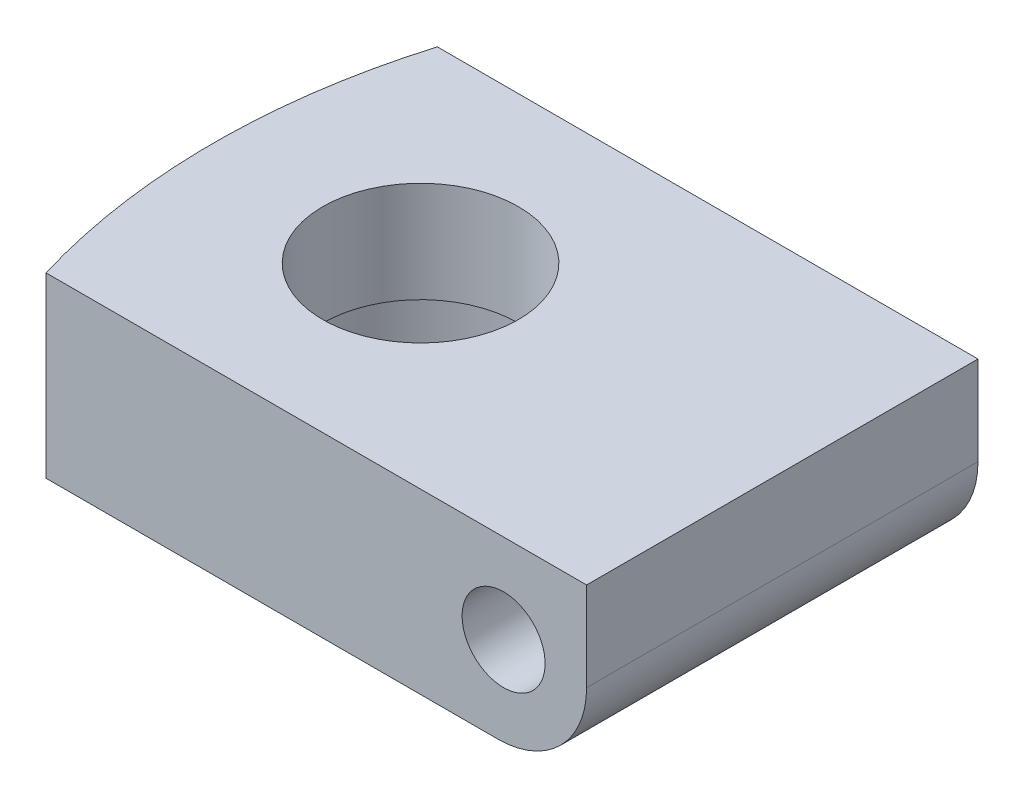
ISO-10303-21;
HEADER;
FILE_DESCRIPTION(('STEP AP214'),'2;1');
FILE_NAME('part.step','',(''),(''),'','','');
FILE_SCHEMA(('AUTOMOTIVE_DESIGN { 1 0 10303 214 1 1 1 1 }'));
ENDSEC;
DATA;
#1=APPLICATION_CONTEXT('core data for automotive mechanical design processes');
#2=APPLICATION_PROTOCOL_DEFINITION('international standard','automotive_design',2000,#1);
#3=PRODUCT_CONTEXT('',#1,'mechanical');
#4=PRODUCT('Part','Part','',(#3));
#5=PRODUCT_RELATED_PRODUCT_CATEGORY('part','',(#4));
#6=PRODUCT_DEFINITION_FORMATION('','',#4);
#7=PRODUCT_DEFINITION_CONTEXT('part definition',#1,'design');
#8=PRODUCT_DEFINITION('design','',#6,#7);
#9=PRODUCT_DEFINITION_SHAPE('','',#8);
#10=(LENGTH_UNIT() NAMED_UNIT(*) SI_UNIT(.MILLI.,.METRE.));
#11=(NAMED_UNIT(*) PLANE_ANGLE_UNIT() SI_UNIT($,.RADIAN.));
#12=(NAMED_UNIT(*) SI_UNIT($,.STERADIAN.) SOLID_ANGLE_UNIT());
#13=UNCERTAINTY_MEASURE_WITH_UNIT(LENGTH_MEASURE(1.E-05),#10,'distance_accuracy_value','');
#14=(GEOMETRIC_REPRESENTATION_CONTEXT(3) GLOBAL_UNCERTAINTY_ASSIGNED_CONTEXT((#13)) GLOBAL_UNIT_ASSIGNED_CONTEXT((#10,
#11,#12)) REPRESENTATION_CONTEXT('',''));
#15=CARTESIAN_POINT('',(0.,0.,0.));
#16=DIRECTION('',(0.,0.,1.));
#17=DIRECTION('',(1.,0.,0.));
#18=AXIS2_PLACEMENT_3D('',#15,#16,#17);
#19=CARTESIAN_POINT('',(0.,30.,-33.));
#20=DIRECTION('',(0.,0.,-1.));
#21=DIRECTION('',(-1.,0.,0.));
#22=AXIS2_PLACEMENT_3D('',#19,#20,#21);
#23=PLANE('',#22);
#24=CARTESIAN_POINT('',(34.,15.,-33.));
#25=DIRECTION('',(0.,0.,-1.));
#26=DIRECTION('',(-1.,0.,0.));
#27=AXIS2_PLACEMENT_3D('',#24,#25,#26);
#28=CIRCLE('',#27,6.34000000000001);
#29=CARTESIAN_POINT('',(27.66,15.,-33.));
#30=VERTEX_POINT('',#29);
#31=EDGE_CURVE('E280',#30,#30,#28,.T.);
#32=ORIENTED_EDGE('',*,*,#31,.F.);
#33=EDGE_LOOP('',(#32));
#34=FACE_BOUND('',#33,.T.);
#35=DIRECTION('',(0.,-1.,0.));
#36=VECTOR('',#35,1.);
#37=CARTESIAN_POINT('',(48.,30.,-33.));
#38=LINE('',#37,#36);
#39=CARTESIAN_POINT('',(48.,30.,-33.));
#40=VERTEX_POINT('',#39);
#41=CARTESIAN_POINT('',(48.,15.,-33.));
#42=VERTEX_POINT('',#41);
#43=EDGE_CURVE('E129',#40,#42,#38,.T.);
#44=ORIENTED_EDGE('',*,*,#43,.T.);
#45=CARTESIAN_POINT('',(33.,15.,-33.));
#46=DIRECTION('',(0.,0.,-1.));
#47=DIRECTION('',(-1.,0.,0.));
#48=AXIS2_PLACEMENT_3D('',#45,#46,#47);
#49=CIRCLE('',#48,15.);
#50=CARTESIAN_POINT('',(33.,0.,-33.));
#51=VERTEX_POINT('',#50);
#52=EDGE_CURVE('E68',#42,#51,#49,.T.);
#53=ORIENTED_EDGE('',*,*,#52,.T.);
#54=DIRECTION('',(1.,0.,0.));
#55=VECTOR('',#54,1.);
#56=CARTESIAN_POINT('',(0.,0.,-33.));
#57=LINE('',#56,#55);
#58=CARTESIAN_POINT('',(-43.1635148313633,0.,-33.));
#59=VERTEX_POINT('',#58);
#60=EDGE_CURVE('E95',#59,#51,#57,.T.);
#61=ORIENTED_EDGE('',*,*,#60,.F.);
#62=DIRECTION('',(0.,-1.,0.));
#63=VECTOR('',#62,1.);
#64=CARTESIAN_POINT('',(-43.1635148313633,30.,-33.));
#65=LINE('',#64,#63);
#66=CARTESIAN_POINT('',(-43.1635148313633,30.,-33.));
#67=VERTEX_POINT('',#66);
#68=EDGE_CURVE('E91',#67,#59,#65,.T.);
#69=ORIENTED_EDGE('',*,*,#68,.F.);
#70=DIRECTION('',(1.,0.,0.));
#71=VECTOR('',#70,1.);
#72=CARTESIAN_POINT('',(0.,30.,-33.));
#73=LINE('',#72,#71);
#74=EDGE_CURVE('E94',#67,#40,#73,.T.);
#75=ORIENTED_EDGE('',*,*,#74,.T.);
#76=EDGE_LOOP('',(#44,#53,#61,#69,#75));
#77=FACE_BOUND('',#76,.T.);
#78=ADVANCED_FACE('F45',(#34,#77),#23,.T.);
#79=CARTESIAN_POINT('',(67.,30.,0.));
#80=DIRECTION('',(0.,-1.,0.));
#81=DIRECTION('',(0.,0.,-1.));
#82=AXIS2_PLACEMENT_3D('',#79,#80,#81);
#83=CYLINDRICAL_SURFACE('',#82,115.);
#84=CARTESIAN_POINT('',(67.,0.,0.));
#85=DIRECTION('',(0.,1.,0.));
#86=DIRECTION('',(0.,0.,1.));
#87=AXIS2_PLACEMENT_3D('',#84,#85,#86);
#88=CIRCLE('',#87,115.);
#89=CARTESIAN_POINT('',(-43.1635148313633,0.,33.));
#90=VERTEX_POINT('',#89);
#91=EDGE_CURVE('E119',#59,#90,#88,.T.);
#92=ORIENTED_EDGE('',*,*,#91,.T.);
#93=DIRECTION('',(0.,-1.,0.));
#94=VECTOR('',#93,1.);
#95=CARTESIAN_POINT('',(-43.1635148313633,30.,33.));
#96=LINE('',#95,#94);
#97=CARTESIAN_POINT('',(-43.1635148313633,30.,33.));
#98=VERTEX_POINT('',#97);
#99=EDGE_CURVE('E100',#98,#90,#96,.T.);
#100=ORIENTED_EDGE('',*,*,#99,.F.);
#101=CARTESIAN_POINT('',(67.,30.,0.));
#102=DIRECTION('',(0.,1.,0.));
#103=DIRECTION('',(0.,0.,1.));
#104=AXIS2_PLACEMENT_3D('',#101,#102,#103);
#105=CIRCLE('',#104,115.);
#106=EDGE_CURVE('E103',#67,#98,#105,.T.);
#107=ORIENTED_EDGE('',*,*,#106,.F.);
#108=ORIENTED_EDGE('',*,*,#68,.T.);
#109=EDGE_LOOP('',(#92,#100,#107,#108));
#110=FACE_BOUND('',#109,.T.);
#111=ADVANCED_FACE('F104',(#110),#83,.T.);
#112=CARTESIAN_POINT('',(0.,30.,33.));
#113=DIRECTION('',(0.,0.,-1.));
#114=DIRECTION('',(-1.,0.,0.));
#115=AXIS2_PLACEMENT_3D('',#112,#113,#114);
#116=PLANE('',#115);
#117=CARTESIAN_POINT('',(34.,15.,33.));
#118=DIRECTION('',(0.,0.,-1.));
#119=DIRECTION('',(-1.,0.,0.));
#120=AXIS2_PLACEMENT_3D('',#117,#118,#119);
#121=CIRCLE('',#120,7.);
#122=CARTESIAN_POINT('',(27.,15.,33.));
#123=VERTEX_POINT('',#122);
#124=EDGE_CURVE('E283',#123,#123,#121,.T.);
#125=ORIENTED_EDGE('',*,*,#124,.T.);
#126=EDGE_LOOP('',(#125));
#127=FACE_BOUND('',#126,.T.);
#128=DIRECTION('',(1.,0.,0.));
#129=VECTOR('',#128,1.);
#130=CARTESIAN_POINT('',(0.,0.,33.));
#131=LINE('',#130,#129);
#132=CARTESIAN_POINT('',(33.,0.,33.));
#133=VERTEX_POINT('',#132);
#134=EDGE_CURVE('E116',#90,#133,#131,.T.);
#135=ORIENTED_EDGE('',*,*,#134,.T.);
#136=CARTESIAN_POINT('',(33.,15.,33.));
#137=DIRECTION('',(0.,0.,-1.));
#138=DIRECTION('',(-1.,0.,0.));
#139=AXIS2_PLACEMENT_3D('',#136,#137,#138);
#140=CIRCLE('',#139,15.);
#141=CARTESIAN_POINT('',(48.,15.,33.));
#142=VERTEX_POINT('',#141);
#143=EDGE_CURVE('E11',#133,#142,#140,.F.);
#144=ORIENTED_EDGE('',*,*,#143,.T.);
#145=DIRECTION('',(0.,-1.,0.));
#146=VECTOR('',#145,1.);
#147=CARTESIAN_POINT('',(48.,30.,33.));
#148=LINE('',#147,#146);
#149=CARTESIAN_POINT('',(48.,30.,33.));
#150=VERTEX_POINT('',#149);
#151=EDGE_CURVE('E137',#150,#142,#148,.T.);
#152=ORIENTED_EDGE('',*,*,#151,.F.);
#153=DIRECTION('',(1.,0.,0.));
#154=VECTOR('',#153,1.);
#155=CARTESIAN_POINT('',(0.,30.,33.));
#156=LINE('',#155,#154);
#157=EDGE_CURVE('E109',#98,#150,#156,.T.);
#158=ORIENTED_EDGE('',*,*,#157,.F.);
#159=ORIENTED_EDGE('',*,*,#99,.T.);
#160=EDGE_LOOP('',(#135,#144,#152,#158,#159));
#161=FACE_BOUND('',#160,.T.);
#162=ADVANCED_FACE('F155',(#127,#161),#116,.F.);
#163=CARTESIAN_POINT('',(48.,30.,0.));
#164=DIRECTION('',(-1.,0.,0.));
#165=DIRECTION('',(0.,0.,1.));
#166=AXIS2_PLACEMENT_3D('',#163,#164,#165);
#167=PLANE('',#166);
#168=ORIENTED_EDGE('',*,*,#151,.T.);
#169=DIRECTION('',(0.,0.,-1.));
#170=VECTOR('',#169,1.);
#171=CARTESIAN_POINT('',(48.,15.,0.));
#172=LINE('',#171,#170);
#173=EDGE_CURVE('E99',#142,#42,#172,.T.);
#174=ORIENTED_EDGE('',*,*,#173,.T.);
#175=ORIENTED_EDGE('',*,*,#43,.F.);
#176=DIRECTION('',(0.,0.,-1.));
#177=VECTOR('',#176,1.);
#178=CARTESIAN_POINT('',(48.,30.,0.));
#179=LINE('',#178,#177);
#180=EDGE_CURVE('E113',#150,#40,#179,.T.);
#181=ORIENTED_EDGE('',*,*,#180,.F.);
#182=EDGE_LOOP('',(#168,#174,#175,#181));
#183=FACE_BOUND('',#182,.T.);
#184=ADVANCED_FACE('F150',(#183),#167,.F.);
#185=CARTESIAN_POINT('',(0.,30.,0.));
#186=DIRECTION('',(0.,1.,0.));
#187=DIRECTION('',(0.,0.,1.));
#188=AXIS2_PLACEMENT_3D('',#185,#186,#187);
#189=PLANE('',#188);
#190=CARTESIAN_POINT('',(-13.,30.,0.));
#191=DIRECTION('',(0.,-1.,0.));
#192=DIRECTION('',(0.,0.,-1.));
#193=AXIS2_PLACEMENT_3D('',#190,#191,#192);
#194=CIRCLE('',#193,16.5);
#195=CARTESIAN_POINT('',(-13.,30.,-16.5));
#196=VERTEX_POINT('',#195);
#197=EDGE_CURVE('E290',#196,#196,#194,.T.);
#198=ORIENTED_EDGE('',*,*,#197,.T.);
#199=EDGE_LOOP('',(#198));
#200=FACE_BOUND('',#199,.T.);
#201=ORIENTED_EDGE('',*,*,#74,.F.);
#202=ORIENTED_EDGE('',*,*,#106,.T.);
#203=ORIENTED_EDGE('',*,*,#157,.T.);
#204=ORIENTED_EDGE('',*,*,#180,.T.);
#205=EDGE_LOOP('',(#201,#202,#203,#204));
#206=FACE_BOUND('',#205,.T.);
#207=ADVANCED_FACE('F111',(#200,#206),#189,.T.);
#208=CARTESIAN_POINT('',(0.,0.,0.));
#209=DIRECTION('',(0.,1.,0.));
#210=DIRECTION('',(0.,0.,1.));
#211=AXIS2_PLACEMENT_3D('',#208,#209,#210);
#212=PLANE('',#211);
#213=CARTESIAN_POINT('',(-13.,0.,0.));
#214=DIRECTION('',(0.,-1.,0.));
#215=DIRECTION('',(0.,0.,-1.));
#216=AXIS2_PLACEMENT_3D('',#213,#214,#215);
#217=CIRCLE('',#216,22.5);
#218=CARTESIAN_POINT('',(-13.,0.,-22.5));
#219=VERTEX_POINT('',#218);
#220=EDGE_CURVE('E122',#219,#219,#217,.T.);
#221=ORIENTED_EDGE('',*,*,#220,.F.);
#222=EDGE_LOOP('',(#221));
#223=FACE_BOUND('',#222,.T.);
#224=ORIENTED_EDGE('',*,*,#60,.T.);
#225=DIRECTION('',(0.,0.,-1.));
#226=VECTOR('',#225,1.);
#227=CARTESIAN_POINT('',(33.,0.,0.));
#228=LINE('',#227,#226);
#229=EDGE_CURVE('E54',#51,#133,#228,.F.);
#230=ORIENTED_EDGE('',*,*,#229,.T.);
#231=ORIENTED_EDGE('',*,*,#134,.F.);
#232=ORIENTED_EDGE('',*,*,#91,.F.);
#233=EDGE_LOOP('',(#224,#230,#231,#232));
#234=FACE_BOUND('',#233,.T.);
#235=ADVANCED_FACE('F156',(#223,#234),#212,.F.);
#236=CARTESIAN_POINT('',(-13.,13.,0.));
#237=DIRECTION('',(0.,-1.,0.));
#238=DIRECTION('',(0.,0.,-1.));
#239=AXIS2_PLACEMENT_3D('',#236,#237,#238);
#240=CYLINDRICAL_SURFACE('',#239,22.5);
#241=CARTESIAN_POINT('',(-13.,13.,0.));
#242=DIRECTION('',(0.,-1.,0.));
#243=DIRECTION('',(0.,0.,-1.));
#244=AXIS2_PLACEMENT_3D('',#241,#242,#243);
#245=CIRCLE('',#244,22.5);
#246=CARTESIAN_POINT('',(-13.,13.,-22.5));
#247=VERTEX_POINT('',#246);
#248=EDGE_CURVE('E132',#247,#247,#245,.T.);
#249=CARTESIAN_POINT('',(-13.,13.,-22.5));
#250=CARTESIAN_POINT('',(-13.,12.8645833333333,-22.5));
#251=CARTESIAN_POINT('',(-13.,12.7291666666667,-22.5));
#252=CARTESIAN_POINT('',(-13.,12.4583333333333,-22.5));
#253=CARTESIAN_POINT('',(-13.,12.3229166666667,-22.5));
#254=CARTESIAN_POINT('',(-13.,12.0520833333333,-22.5));
#255=CARTESIAN_POINT('',(-13.,11.9166666666667,-22.5));
#256=CARTESIAN_POINT('',(-13.,11.6458333333333,-22.5));
#257=CARTESIAN_POINT('',(-13.,11.5104166666667,-22.5));
#258=CARTESIAN_POINT('',(-13.,11.2395833333333,-22.5));
#259=CARTESIAN_POINT('',(-13.,11.1041666666667,-22.5));
#260=CARTESIAN_POINT('',(-13.,10.8333333333333,-22.5));
#261=CARTESIAN_POINT('',(-13.,10.6979166666667,-22.5));
#262=CARTESIAN_POINT('',(-13.,10.4270833333333,-22.5));
#263=CARTESIAN_POINT('',(-13.,10.2916666666667,-22.5));
#264=CARTESIAN_POINT('',(-13.,10.0208333333333,-22.5));
#265=CARTESIAN_POINT('',(-13.,9.88541666666667,-22.5));
#266=CARTESIAN_POINT('',(-13.,9.61458333333333,-22.5));
#267=CARTESIAN_POINT('',(-13.,9.47916666666667,-22.5));
#268=CARTESIAN_POINT('',(-13.,9.20833333333333,-22.5));
#269=CARTESIAN_POINT('',(-13.,9.07291666666667,-22.5));
#270=CARTESIAN_POINT('',(-13.,8.80208333333333,-22.5));
#271=CARTESIAN_POINT('',(-13.,8.66666666666667,-22.5));
#272=CARTESIAN_POINT('',(-13.,8.39583333333333,-22.5));
#273=CARTESIAN_POINT('',(-13.,8.26041666666667,-22.5));
#274=CARTESIAN_POINT('',(-13.,7.98958333333333,-22.5));
#275=CARTESIAN_POINT('',(-13.,7.85416666666667,-22.5));
#276=CARTESIAN_POINT('',(-13.,7.58333333333333,-22.5));
#277=CARTESIAN_POINT('',(-13.,7.44791666666667,-22.5));
#278=CARTESIAN_POINT('',(-13.,7.17708333333333,-22.5));
#279=CARTESIAN_POINT('',(-13.,7.04166666666667,-22.5));
#280=CARTESIAN_POINT('',(-13.,6.77083333333333,-22.5));
#281=CARTESIAN_POINT('',(-13.,6.63541666666667,-22.5));
#282=CARTESIAN_POINT('',(-13.,6.36458333333333,-22.5));
#283=CARTESIAN_POINT('',(-13.,6.22916666666667,-22.5));
#284=CARTESIAN_POINT('',(-13.,5.95833333333333,-22.5));
#285=CARTESIAN_POINT('',(-13.,5.82291666666667,-22.5));
#286=CARTESIAN_POINT('',(-13.,5.55208333333333,-22.5));
#287=CARTESIAN_POINT('',(-13.,5.41666666666667,-22.5));
#288=CARTESIAN_POINT('',(-13.,5.14583333333333,-22.5));
#289=CARTESIAN_POINT('',(-13.,5.01041666666667,-22.5));
#290=CARTESIAN_POINT('',(-13.,4.73958333333333,-22.5));
#291=CARTESIAN_POINT('',(-13.,4.60416666666667,-22.5));
#292=CARTESIAN_POINT('',(-13.,4.33333333333333,-22.5));
#293=CARTESIAN_POINT('',(-13.,4.19791666666667,-22.5));
#294=CARTESIAN_POINT('',(-13.,3.92708333333333,-22.5));
#295=CARTESIAN_POINT('',(-13.,3.79166666666667,-22.5));
#296=CARTESIAN_POINT('',(-13.,3.52083333333333,-22.5));
#297=CARTESIAN_POINT('',(-13.,3.38541666666667,-22.5));
#298=CARTESIAN_POINT('',(-13.,3.11458333333333,-22.5));
#299=CARTESIAN_POINT('',(-13.,2.97916666666667,-22.5));
#300=CARTESIAN_POINT('',(-13.,2.70833333333333,-22.5));
#301=CARTESIAN_POINT('',(-13.,2.57291666666667,-22.5));
#302=CARTESIAN_POINT('',(-13.,2.30208333333333,-22.5));
#303=CARTESIAN_POINT('',(-13.,2.16666666666667,-22.5));
#304=CARTESIAN_POINT('',(-13.,1.89583333333333,-22.5));
#305=CARTESIAN_POINT('',(-13.,1.76041666666667,-22.5));
#306=CARTESIAN_POINT('',(-13.,1.48958333333333,-22.5));
#307=CARTESIAN_POINT('',(-13.,1.35416666666667,-22.5));
#308=CARTESIAN_POINT('',(-13.,1.08333333333333,-22.5));
#309=CARTESIAN_POINT('',(-13.,0.947916666666667,-22.5));
#310=CARTESIAN_POINT('',(-13.,0.677083333333334,-22.5));
#311=CARTESIAN_POINT('',(-13.,0.541666666666667,-22.5));
#312=CARTESIAN_POINT('',(-13.,0.270833333333334,-22.5));
#313=CARTESIAN_POINT('',(-13.,0.135416666666667,-22.5));
#314=CARTESIAN_POINT('',(-13.,0.,-22.5));
#315=B_SPLINE_CURVE_WITH_KNOTS('',3,(#249,#250,#251,#252,#253,#254,#255,#256,#257,#258,#259,
#260,#261,#262,#263,#264,#265,#266,#267,#268,#269,#270,#271,#272,#273,#274,#275,#276,#277,#278,
#279,#280,#281,#282,#283,#284,#285,#286,#287,#288,#289,#290,#291,#292,#293,#294,#295,#296,#297,
#298,#299,#300,#301,#302,#303,#304,#305,#306,#307,#308,#309,#310,#311,#312,#313,#314),
.UNSPECIFIED.,.F.,.F.,(4,2,2,2,2,2,2,2,2,2,2,2,2,2,2,2,2,2,2,2,2,2,2,2,2,2,2,2,2,2,2,2,4),(0.,
0.406249999999999,0.812499999999999,1.21875,1.625,2.03125,2.4375,2.84375,3.25,3.65625,4.0625,
4.46875,4.875,5.28125,5.6875,6.09375,6.5,6.90625,7.3125,7.71875,8.125,8.53125,8.9375,9.34375,
9.75,10.15625,10.5625,10.96875,11.375,11.78125,12.1875,12.59375,13.),.UNSPECIFIED.);
#316=EDGE_CURVE('BSEAM158',#247,#219,#315,.T.);
#317=ORIENTED_EDGE('',*,*,#248,.F.);
#318=ORIENTED_EDGE('',*,*,#220,.T.);
#319=ORIENTED_EDGE('',*,*,#316,.T.);
#320=ORIENTED_EDGE('',*,*,#316,.F.);
#321=EDGE_LOOP('',(#317,#319,#318,#320));
#322=FACE_BOUND('',#321,.T.);
#323=ADVANCED_FACE('F158',(#322),#240,.F.);
#324=CARTESIAN_POINT('',(-13.,13.,0.));
#325=DIRECTION('',(0.,-1.,0.));
#326=DIRECTION('',(0.,0.,-1.));
#327=AXIS2_PLACEMENT_3D('',#324,#325,#326);
#328=PLANE('',#327);
#329=CARTESIAN_POINT('',(-13.,13.,0.));
#330=DIRECTION('',(0.,-1.,0.));
#331=DIRECTION('',(0.,0.,-1.));
#332=AXIS2_PLACEMENT_3D('',#329,#330,#331);
#333=CIRCLE('',#332,16.5);
#334=CARTESIAN_POINT('',(-13.,13.,-16.5));
#335=VERTEX_POINT('',#334);
#336=EDGE_CURVE('E285',#335,#335,#333,.T.);
#337=ORIENTED_EDGE('',*,*,#336,.F.);
#338=EDGE_LOOP('',(#337));
#339=FACE_BOUND('',#338,.T.);
#340=ORIENTED_EDGE('',*,*,#248,.T.);
#341=EDGE_LOOP('',(#340));
#342=FACE_BOUND('',#341,.T.);
#343=ADVANCED_FACE('F165',(#339,#342),#328,.T.);
#344=CARTESIAN_POINT('',(-13.,30.,0.));
#345=DIRECTION('',(0.,-1.,0.));
#346=DIRECTION('',(0.,0.,-1.));
#347=AXIS2_PLACEMENT_3D('',#344,#345,#346);
#348=CYLINDRICAL_SURFACE('',#347,16.5);
#349=ORIENTED_EDGE('',*,*,#197,.F.);
#350=EDGE_LOOP('',(#349));
#351=FACE_BOUND('',#350,.T.);
#352=ORIENTED_EDGE('',*,*,#336,.T.);
#353=EDGE_LOOP('',(#352));
#354=FACE_BOUND('',#353,.T.);
#355=ADVANCED_FACE('F206',(#351,#354),#348,.F.);
#356=CARTESIAN_POINT('',(33.,15.,0.));
#357=DIRECTION('',(0.,0.,-1.));
#358=DIRECTION('',(-1.,0.,0.));
#359=AXIS2_PLACEMENT_3D('',#356,#357,#358);
#360=CYLINDRICAL_SURFACE('',#359,15.);
#361=ORIENTED_EDGE('',*,*,#143,.F.);
#362=ORIENTED_EDGE('',*,*,#229,.F.);
#363=ORIENTED_EDGE('',*,*,#52,.F.);
#364=ORIENTED_EDGE('',*,*,#173,.F.);
#365=EDGE_LOOP('',(#361,#362,#363,#364));
#366=FACE_BOUND('',#365,.T.);
#367=ADVANCED_FACE('F47',(#366),#360,.T.);
#368=CARTESIAN_POINT('',(34.,15.,33.));
#369=DIRECTION('',(0.,0.,1.));
#370=DIRECTION('',(1.,0.,0.));
#371=AXIS2_PLACEMENT_3D('',#368,#369,#370);
#372=CONICAL_SURFACE('',#371,7.,0.00999966668666515);
#373=ORIENTED_EDGE('',*,*,#31,.T.);
#374=EDGE_LOOP('',(#373));
#375=FACE_BOUND('',#374,.T.);
#376=ORIENTED_EDGE('',*,*,#124,.F.);
#377=EDGE_LOOP('',(#376));
#378=FACE_BOUND('',#377,.T.);
#379=ADVANCED_FACE('F227',(#375,#378),#372,.F.);
#380=CLOSED_SHELL('',(#78,#111,#162,#184,#207,#235,#323,#343,#355,#367,#379));
#381=MANIFOLD_SOLID_BREP('B2',#380);
#382=ADVANCED_BREP_SHAPE_REPRESENTATION('',(#18,#381),#14);
#383=SHAPE_DEFINITION_REPRESENTATION(#9,#382);
ENDSEC;
END-ISO-10303-21;
